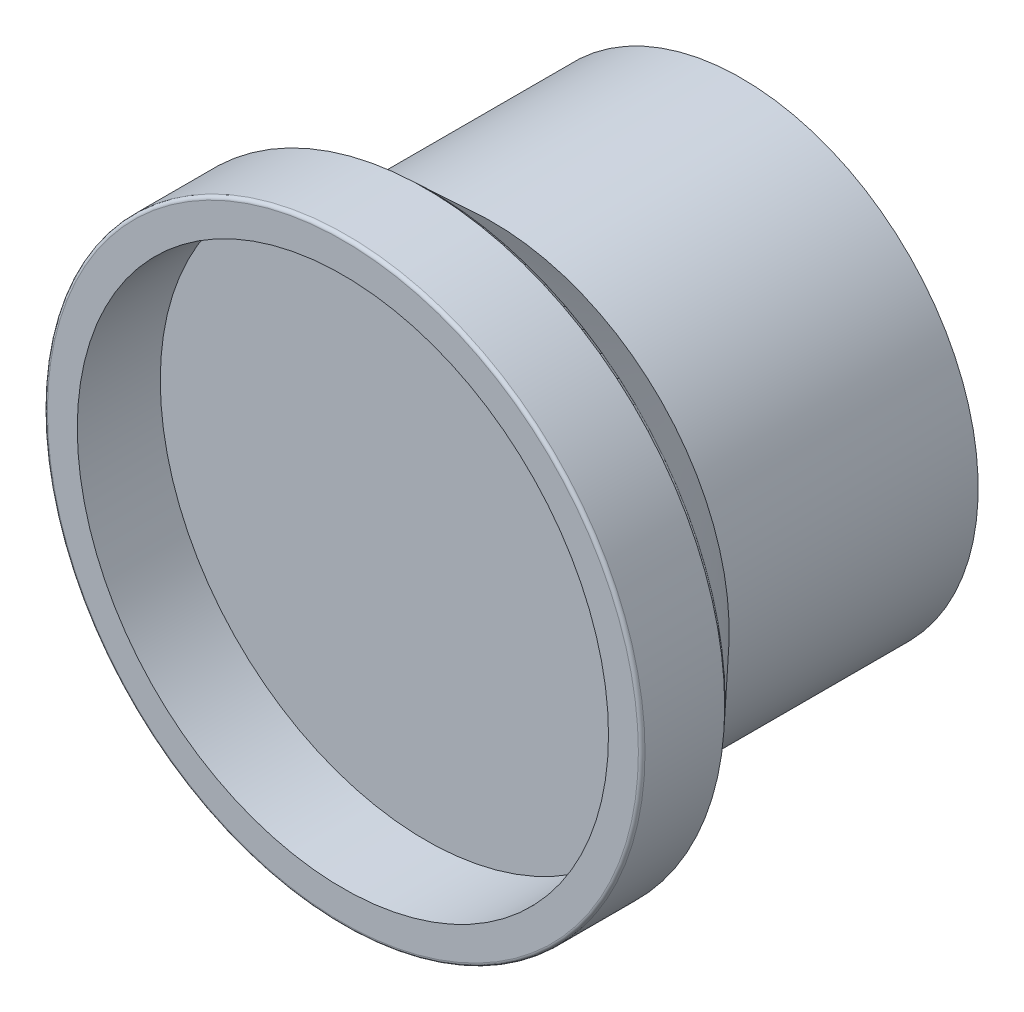
ISO-10303-21;
HEADER;
FILE_DESCRIPTION(('STEP AP214'),'2;1');
FILE_NAME('part.step','',(''),(''),'','','');
FILE_SCHEMA(('AUTOMOTIVE_DESIGN { 1 0 10303 214 1 1 1 1 }'));
ENDSEC;
DATA;
#1=APPLICATION_CONTEXT('core data for automotive mechanical design processes');
#2=APPLICATION_PROTOCOL_DEFINITION('international standard','automotive_design',2000,#1);
#3=PRODUCT_CONTEXT('',#1,'mechanical');
#4=PRODUCT('Part','Part','',(#3));
#5=PRODUCT_RELATED_PRODUCT_CATEGORY('part','',(#4));
#6=PRODUCT_DEFINITION_FORMATION('','',#4);
#7=PRODUCT_DEFINITION_CONTEXT('part definition',#1,'design');
#8=PRODUCT_DEFINITION('design','',#6,#7);
#9=PRODUCT_DEFINITION_SHAPE('','',#8);
#10=(LENGTH_UNIT() NAMED_UNIT(*) SI_UNIT(.MILLI.,.METRE.));
#11=(NAMED_UNIT(*) PLANE_ANGLE_UNIT() SI_UNIT($,.RADIAN.));
#12=(NAMED_UNIT(*) SI_UNIT($,.STERADIAN.) SOLID_ANGLE_UNIT());
#13=UNCERTAINTY_MEASURE_WITH_UNIT(LENGTH_MEASURE(1.E-05),#10,'distance_accuracy_value','');
#14=(GEOMETRIC_REPRESENTATION_CONTEXT(3) GLOBAL_UNCERTAINTY_ASSIGNED_CONTEXT((#13)) GLOBAL_UNIT_ASSIGNED_CONTEXT((#10,
#11,#12)) REPRESENTATION_CONTEXT('',''));
#15=CARTESIAN_POINT('',(0.,0.,0.));
#16=DIRECTION('',(0.,0.,1.));
#17=DIRECTION('',(1.,0.,0.));
#18=AXIS2_PLACEMENT_3D('',#15,#16,#17);
#19=CARTESIAN_POINT('',(0.,0.,0.));
#20=DIRECTION('',(0.,0.,1.));
#21=DIRECTION('',(1.,0.,0.));
#22=AXIS2_PLACEMENT_3D('',#19,#20,#21);
#23=PLANE('',#22);
#24=CARTESIAN_POINT('',(0.,0.,0.));
#25=DIRECTION('',(0.,0.,1.));
#26=DIRECTION('',(1.,0.,0.));
#27=AXIS2_PLACEMENT_3D('',#24,#25,#26);
#28=CIRCLE('',#27,876.988868705343);
#29=CARTESIAN_POINT('',(876.988868705343,0.,0.));
#30=VERTEX_POINT('',#29);
#31=EDGE_CURVE('E65',#30,#30,#28,.T.);
#32=ORIENTED_EDGE('',*,*,#31,.T.);
#33=EDGE_LOOP('',(#32));
#34=FACE_BOUND('',#33,.T.);
#35=ADVANCED_FACE('F51',(#34),#23,.T.);
#36=CARTESIAN_POINT('',(0.,0.,0.));
#37=DIRECTION('',(0.,0.,1.));
#38=DIRECTION('',(1.,0.,0.));
#39=AXIS2_PLACEMENT_3D('',#36,#37,#38);
#40=CONICAL_SURFACE('',#39,900.,0.750895437942456);
#41=CARTESIAN_POINT('',(0.,0.,-16.8229366863897));
#42=DIRECTION('',(0.,0.,-1.));
#43=DIRECTION('',(-1.,0.,0.));
#44=AXIS2_PLACEMENT_3D('',#41,#42,#43);
#45=CIRCLE('',#44,884.299650809435);
#46=CARTESIAN_POINT('',(-884.299650809435,0.,-16.8229366863897));
#47=VERTEX_POINT('',#46);
#48=EDGE_CURVE('E59',#47,#47,#45,.T.);
#49=ORIENTED_EDGE('',*,*,#48,.T.);
#50=EDGE_LOOP('',(#49));
#51=FACE_BOUND('',#50,.T.);
#52=CARTESIAN_POINT('',(0.,0.,-200.705378626882));
#53=DIRECTION('',(0.,0.,-1.));
#54=DIRECTION('',(-1.,0.,0.));
#55=AXIS2_PLACEMENT_3D('',#52,#53,#54);
#56=CIRCLE('',#55,712.687606949391);
#57=CARTESIAN_POINT('',(-712.687606949391,0.,-200.705378626882));
#58=VERTEX_POINT('',#57);
#59=EDGE_CURVE('E74',#58,#58,#56,.T.);
#60=ORIENTED_EDGE('',*,*,#59,.F.);
#61=EDGE_LOOP('',(#60));
#62=FACE_BOUND('',#61,.T.);
#63=ADVANCED_FACE('F100',(#51,#62),#40,.T.);
#64=CARTESIAN_POINT('',(0.,0.,-10.));
#65=DIRECTION('',(0.,0.,1.));
#66=DIRECTION('',(1.,0.,0.));
#67=AXIS2_PLACEMENT_3D('',#64,#65,#66);
#68=TOROIDAL_SURFACE('',#67,876.988868705343,10.);
#69=ORIENTED_EDGE('',*,*,#48,.F.);
#70=EDGE_LOOP('',(#69));
#71=FACE_BOUND('',#70,.T.);
#72=ORIENTED_EDGE('',*,*,#31,.F.);
#73=EDGE_LOOP('',(#72));
#74=FACE_BOUND('',#73,.T.);
#75=ADVANCED_FACE('F53',(#71,#74),#68,.T.);
#76=CARTESIAN_POINT('',(0.,0.,-950.705378626882));
#77=DIRECTION('',(0.,0.,-1.));
#78=DIRECTION('',(-1.,0.,0.));
#79=AXIS2_PLACEMENT_3D('',#76,#77,#78);
#80=PLANE('',#79);
#81=CARTESIAN_POINT('',(0.,0.,-950.705378626882));
#82=DIRECTION('',(0.,0.,-1.));
#83=DIRECTION('',(-1.,0.,0.));
#84=AXIS2_PLACEMENT_3D('',#81,#82,#83);
#85=CIRCLE('',#84,712.687606949391);
#86=CARTESIAN_POINT('',(-712.687606949391,0.,-950.705378626882));
#87=VERTEX_POINT('',#86);
#88=EDGE_CURVE('E71',#87,#87,#85,.T.);
#89=ORIENTED_EDGE('',*,*,#88,.T.);
#90=EDGE_LOOP('',(#89));
#91=FACE_BOUND('',#90,.T.);
#92=CARTESIAN_POINT('',(0.,0.,-950.705378626882));
#93=DIRECTION('',(0.,0.,-1.));
#94=DIRECTION('',(-1.,0.,0.));
#95=AXIS2_PLACEMENT_3D('',#92,#93,#94);
#96=CIRCLE('',#95,600.);
#97=CARTESIAN_POINT('',(-600.,0.,-950.705378626882));
#98=VERTEX_POINT('',#97);
#99=EDGE_CURVE('E78',#98,#98,#96,.T.);
#100=ORIENTED_EDGE('',*,*,#99,.F.);
#101=EDGE_LOOP('',(#100));
#102=FACE_BOUND('',#101,.T.);
#103=ADVANCED_FACE('F89',(#91,#102),#80,.T.);
#104=CARTESIAN_POINT('',(0.,0.,-950.705378626882));
#105=DIRECTION('',(0.,0.,1.));
#106=DIRECTION('',(1.,0.,0.));
#107=AXIS2_PLACEMENT_3D('',#104,#105,#106);
#108=CYLINDRICAL_SURFACE('',#107,712.687606949391);
#109=ORIENTED_EDGE('',*,*,#88,.F.);
#110=EDGE_LOOP('',(#109));
#111=FACE_BOUND('',#110,.T.);
#112=ORIENTED_EDGE('',*,*,#59,.T.);
#113=EDGE_LOOP('',(#112));
#114=FACE_BOUND('',#113,.T.);
#115=ADVANCED_FACE('F91',(#111,#114),#108,.T.);
#116=CARTESIAN_POINT('',(0.,0.,-950.705378626882));
#117=DIRECTION('',(0.,0.,1.));
#118=DIRECTION('',(1.,0.,0.));
#119=AXIS2_PLACEMENT_3D('',#116,#117,#118);
#120=CYLINDRICAL_SURFACE('',#119,600.);
#121=CARTESIAN_POINT('',(0.,0.,-900.705378626882));
#122=DIRECTION('',(0.,0.,-1.));
#123=DIRECTION('',(-1.,0.,0.));
#124=AXIS2_PLACEMENT_3D('',#121,#122,#123);
#125=CIRCLE('',#124,600.);
#126=CARTESIAN_POINT('',(-600.,0.,-900.705378626882));
#127=VERTEX_POINT('',#126);
#128=EDGE_CURVE('E11',#127,#127,#125,.T.);
#129=ORIENTED_EDGE('',*,*,#128,.F.);
#130=EDGE_LOOP('',(#129));
#131=FACE_BOUND('',#130,.T.);
#132=ORIENTED_EDGE('',*,*,#99,.T.);
#133=EDGE_LOOP('',(#132));
#134=FACE_BOUND('',#133,.T.);
#135=ADVANCED_FACE('F87',(#131,#134),#120,.F.);
#136=CARTESIAN_POINT('',(0.,0.,-900.705378626882));
#137=DIRECTION('',(0.,0.,-1.));
#138=DIRECTION('',(-1.,0.,0.));
#139=AXIS2_PLACEMENT_3D('',#136,#137,#138);
#140=PLANE('',#139);
#141=ORIENTED_EDGE('',*,*,#128,.T.);
#142=EDGE_LOOP('',(#141));
#143=FACE_BOUND('',#142,.T.);
#144=ADVANCED_FACE('F141',(#143),#140,.T.);
#145=CLOSED_SHELL('',(#35,#63,#75,#103,#115,#135,#144));
#146=MANIFOLD_SOLID_BREP('B2',#145);
#147=CARTESIAN_POINT('',(0.,0.,250.));
#148=DIRECTION('',(0.,0.,1.));
#149=DIRECTION('',(1.,0.,0.));
#150=AXIS2_PLACEMENT_3D('',#147,#148,#149);
#151=PLANE('',#150);
#152=CARTESIAN_POINT('',(0.,0.,250.));
#153=DIRECTION('',(0.,0.,1.));
#154=DIRECTION('',(1.,0.,0.));
#155=AXIS2_PLACEMENT_3D('',#152,#153,#154);
#156=CIRCLE('',#155,890.);
#157=CARTESIAN_POINT('',(890.,0.,250.));
#158=VERTEX_POINT('',#157);
#159=EDGE_CURVE('E172',#158,#158,#156,.T.);
#160=ORIENTED_EDGE('',*,*,#159,.T.);
#161=EDGE_LOOP('',(#160));
#162=FACE_BOUND('',#161,.T.);
#163=CARTESIAN_POINT('',(0.,0.,250.));
#164=DIRECTION('',(0.,0.,1.));
#165=DIRECTION('',(1.,0.,0.));
#166=AXIS2_PLACEMENT_3D('',#163,#164,#165);
#167=CIRCLE('',#166,800.);
#168=CARTESIAN_POINT('',(800.,0.,250.));
#169=VERTEX_POINT('',#168);
#170=EDGE_CURVE('E184',#169,#169,#167,.T.);
#171=ORIENTED_EDGE('',*,*,#170,.F.);
#172=EDGE_LOOP('',(#171));
#173=FACE_BOUND('',#172,.T.);
#174=ADVANCED_FACE('F164',(#162,#173),#151,.T.);
#175=CARTESIAN_POINT('',(0.,0.,0.));
#176=DIRECTION('',(0.,0.,1.));
#177=DIRECTION('',(1.,0.,0.));
#178=AXIS2_PLACEMENT_3D('',#175,#176,#177);
#179=PLANE('',#178);
#180=CARTESIAN_POINT('',(0.,0.,0.));
#181=DIRECTION('',(0.,0.,1.));
#182=DIRECTION('',(1.,0.,0.));
#183=AXIS2_PLACEMENT_3D('',#180,#181,#182);
#184=CIRCLE('',#183,900.);
#185=CARTESIAN_POINT('',(900.,0.,0.));
#186=VERTEX_POINT('',#185);
#187=EDGE_CURVE('E178',#186,#186,#184,.T.);
#188=ORIENTED_EDGE('',*,*,#187,.F.);
#189=EDGE_LOOP('',(#188));
#190=FACE_BOUND('',#189,.T.);
#191=CARTESIAN_POINT('',(0.,0.,0.));
#192=DIRECTION('',(0.,0.,1.));
#193=DIRECTION('',(1.,0.,0.));
#194=AXIS2_PLACEMENT_3D('',#191,#192,#193);
#195=CIRCLE('',#194,800.);
#196=CARTESIAN_POINT('',(800.,0.,0.));
#197=VERTEX_POINT('',#196);
#198=EDGE_CURVE('E187',#197,#197,#195,.T.);
#199=ORIENTED_EDGE('',*,*,#198,.T.);
#200=EDGE_LOOP('',(#199));
#201=FACE_BOUND('',#200,.T.);
#202=ADVANCED_FACE('F200',(#190,#201),#179,.F.);
#203=CARTESIAN_POINT('',(0.,0.,250.));
#204=DIRECTION('',(0.,0.,-1.));
#205=DIRECTION('',(-1.,0.,0.));
#206=AXIS2_PLACEMENT_3D('',#203,#204,#205);
#207=CYLINDRICAL_SURFACE('',#206,900.);
#208=CARTESIAN_POINT('',(0.,0.,240.));
#209=DIRECTION('',(0.,0.,1.));
#210=DIRECTION('',(1.,0.,0.));
#211=AXIS2_PLACEMENT_3D('',#208,#209,#210);
#212=CIRCLE('',#211,900.);
#213=CARTESIAN_POINT('',(900.,0.,240.));
#214=VERTEX_POINT('',#213);
#215=EDGE_CURVE('E50',#214,#214,#212,.F.);
#216=ORIENTED_EDGE('',*,*,#215,.T.);
#217=EDGE_LOOP('',(#216));
#218=FACE_BOUND('',#217,.T.);
#219=ORIENTED_EDGE('',*,*,#187,.T.);
#220=EDGE_LOOP('',(#219));
#221=FACE_BOUND('',#220,.T.);
#222=ADVANCED_FACE('F207',(#218,#221),#207,.T.);
#223=CARTESIAN_POINT('',(0.,0.,250.));
#224=DIRECTION('',(0.,0.,-1.));
#225=DIRECTION('',(-1.,0.,0.));
#226=AXIS2_PLACEMENT_3D('',#223,#224,#225);
#227=CYLINDRICAL_SURFACE('',#226,800.);
#228=ORIENTED_EDGE('',*,*,#170,.T.);
#229=EDGE_LOOP('',(#228));
#230=FACE_BOUND('',#229,.T.);
#231=ORIENTED_EDGE('',*,*,#198,.F.);
#232=EDGE_LOOP('',(#231));
#233=FACE_BOUND('',#232,.T.);
#234=ADVANCED_FACE('F196',(#230,#233),#227,.F.);
#235=CARTESIAN_POINT('',(0.,0.,240.));
#236=DIRECTION('',(0.,0.,1.));
#237=DIRECTION('',(1.,0.,0.));
#238=AXIS2_PLACEMENT_3D('',#235,#236,#237);
#239=TOROIDAL_SURFACE('',#238,890.,10.);
#240=ORIENTED_EDGE('',*,*,#215,.F.);
#241=EDGE_LOOP('',(#240));
#242=FACE_BOUND('',#241,.T.);
#243=ORIENTED_EDGE('',*,*,#159,.F.);
#244=EDGE_LOOP('',(#243));
#245=FACE_BOUND('',#244,.T.);
#246=ADVANCED_FACE('F166',(#242,#245),#239,.T.);
#247=CLOSED_SHELL('',(#174,#202,#222,#234,#246));
#248=MANIFOLD_SOLID_BREP('B6',#247);
#249=ADVANCED_BREP_SHAPE_REPRESENTATION('',(#18,#146,#248),#14);
#250=SHAPE_DEFINITION_REPRESENTATION(#9,#249);
ENDSEC;
END-ISO-10303-21;
